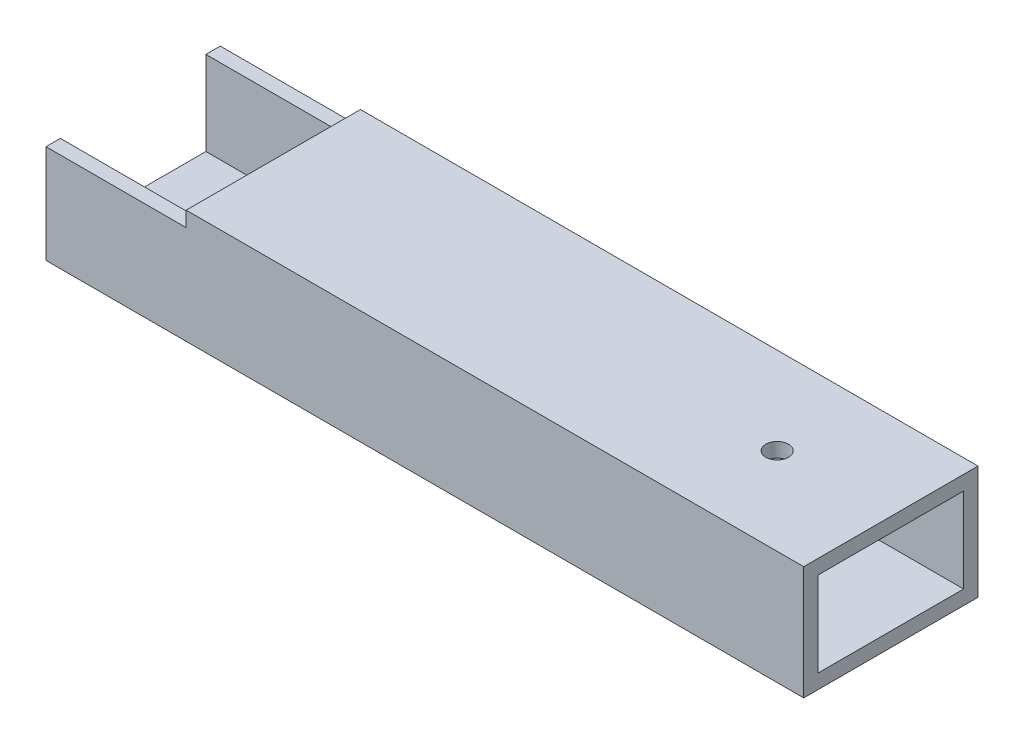
ISO-10303-21;
HEADER;
FILE_DESCRIPTION(('STEP AP214'),'2;1');
FILE_NAME('part.step','',(''),(''),'','','');
FILE_SCHEMA(('AUTOMOTIVE_DESIGN { 1 0 10303 214 1 1 1 1 }'));
ENDSEC;
DATA;
#1=APPLICATION_CONTEXT('core data for automotive mechanical design processes');
#2=APPLICATION_PROTOCOL_DEFINITION('international standard','automotive_design',2000,#1);
#3=PRODUCT_CONTEXT('',#1,'mechanical');
#4=PRODUCT('Part','Part','',(#3));
#5=PRODUCT_RELATED_PRODUCT_CATEGORY('part','',(#4));
#6=PRODUCT_DEFINITION_FORMATION('','',#4);
#7=PRODUCT_DEFINITION_CONTEXT('part definition',#1,'design');
#8=PRODUCT_DEFINITION('design','',#6,#7);
#9=PRODUCT_DEFINITION_SHAPE('','',#8);
#10=(LENGTH_UNIT() NAMED_UNIT(*) SI_UNIT(.MILLI.,.METRE.));
#11=(NAMED_UNIT(*) PLANE_ANGLE_UNIT() SI_UNIT($,.RADIAN.));
#12=(NAMED_UNIT(*) SI_UNIT($,.STERADIAN.) SOLID_ANGLE_UNIT());
#13=UNCERTAINTY_MEASURE_WITH_UNIT(LENGTH_MEASURE(1.E-05),#10,'distance_accuracy_value','');
#14=(GEOMETRIC_REPRESENTATION_CONTEXT(3) GLOBAL_UNCERTAINTY_ASSIGNED_CONTEXT((#13)) GLOBAL_UNIT_ASSIGNED_CONTEXT((#10,
#11,#12)) REPRESENTATION_CONTEXT('',''));
#15=CARTESIAN_POINT('',(0.,0.,0.));
#16=DIRECTION('',(0.,0.,1.));
#17=DIRECTION('',(1.,0.,0.));
#18=AXIS2_PLACEMENT_3D('',#15,#16,#17);
#19=CARTESIAN_POINT('',(-50.,2.,-9.5));
#20=DIRECTION('',(1.,0.,0.));
#21=DIRECTION('',(0.,0.,-1.));
#22=AXIS2_PLACEMENT_3D('',#19,#20,#21);
#23=PLANE('',#22);
#24=DIRECTION('',(0.,-1.,0.));
#25=VECTOR('',#24,1.);
#26=CARTESIAN_POINT('',(-50.,0.,-9.6));
#27=LINE('',#26,#25);
#28=CARTESIAN_POINT('',(-50.,0.,-9.6));
#29=VERTEX_POINT('',#28);
#30=CARTESIAN_POINT('',(-50.,-11.1,-9.6));
#31=VERTEX_POINT('',#30);
#32=EDGE_CURVE('E199',#29,#31,#27,.T.);
#33=ORIENTED_EDGE('',*,*,#32,.F.);
#34=DIRECTION('',(0.,0.,1.));
#35=VECTOR('',#34,1.);
#36=CARTESIAN_POINT('',(-50.,0.,0.));
#37=LINE('',#36,#35);
#38=CARTESIAN_POINT('',(-50.,0.,-11.5));
#39=VERTEX_POINT('',#38);
#40=EDGE_CURVE('E169',#39,#29,#37,.T.);
#41=ORIENTED_EDGE('',*,*,#40,.F.);
#42=DIRECTION('',(0.,1.,0.));
#43=VECTOR('',#42,1.);
#44=CARTESIAN_POINT('',(-50.,-13.,-11.5));
#45=LINE('',#44,#43);
#46=CARTESIAN_POINT('',(-50.,-13.,-11.5));
#47=VERTEX_POINT('',#46);
#48=EDGE_CURVE('E237',#47,#39,#45,.T.);
#49=ORIENTED_EDGE('',*,*,#48,.F.);
#50=DIRECTION('',(0.,0.,1.));
#51=VECTOR('',#50,1.);
#52=CARTESIAN_POINT('',(-50.,-13.,0.));
#53=LINE('',#52,#51);
#54=CARTESIAN_POINT('',(-50.,-13.,11.5));
#55=VERTEX_POINT('',#54);
#56=EDGE_CURVE('E247',#47,#55,#53,.T.);
#57=ORIENTED_EDGE('',*,*,#56,.T.);
#58=DIRECTION('',(0.,1.,0.));
#59=VECTOR('',#58,1.);
#60=CARTESIAN_POINT('',(-50.,-13.,11.5));
#61=LINE('',#60,#59);
#62=CARTESIAN_POINT('',(-50.,0.,11.5));
#63=VERTEX_POINT('',#62);
#64=EDGE_CURVE('E253',#55,#63,#61,.T.);
#65=ORIENTED_EDGE('',*,*,#64,.T.);
#66=CARTESIAN_POINT('',(-50.,0.,9.6));
#67=VERTEX_POINT('',#66);
#68=EDGE_CURVE('E164',#67,#63,#37,.T.);
#69=ORIENTED_EDGE('',*,*,#68,.F.);
#70=DIRECTION('',(0.,-1.,0.));
#71=VECTOR('',#70,1.);
#72=CARTESIAN_POINT('',(-50.,0.,9.6));
#73=LINE('',#72,#71);
#74=CARTESIAN_POINT('',(-50.,-11.1,9.6));
#75=VERTEX_POINT('',#74);
#76=EDGE_CURVE('E192',#67,#75,#73,.T.);
#77=ORIENTED_EDGE('',*,*,#76,.T.);
#78=DIRECTION('',(0.,0.,-1.));
#79=VECTOR('',#78,1.);
#80=CARTESIAN_POINT('',(-50.,-11.1,0.));
#81=LINE('',#80,#79);
#82=EDGE_CURVE('E195',#75,#31,#81,.T.);
#83=ORIENTED_EDGE('',*,*,#82,.T.);
#84=EDGE_LOOP('',(#33,#41,#49,#57,#65,#69,#77,#83));
#85=FACE_BOUND('',#84,.T.);
#86=ADVANCED_FACE('F70',(#85),#23,.F.);
#87=CARTESIAN_POINT('',(50.,2.,-9.5));
#88=DIRECTION('',(1.,0.,0.));
#89=DIRECTION('',(0.,0.,-1.));
#90=AXIS2_PLACEMENT_3D('',#87,#88,#89);
#91=PLANE('',#90);
#92=DIRECTION('',(0.,0.,1.));
#93=VECTOR('',#92,1.);
#94=CARTESIAN_POINT('',(50.,-13.,0.));
#95=LINE('',#94,#93);
#96=CARTESIAN_POINT('',(50.,-13.,-11.5));
#97=VERTEX_POINT('',#96);
#98=CARTESIAN_POINT('',(50.,-13.,11.5));
#99=VERTEX_POINT('',#98);
#100=EDGE_CURVE('E245',#97,#99,#95,.T.);
#101=ORIENTED_EDGE('',*,*,#100,.F.);
#102=DIRECTION('',(0.,1.,0.));
#103=VECTOR('',#102,1.);
#104=CARTESIAN_POINT('',(50.,-13.,-11.5));
#105=LINE('',#104,#103);
#106=CARTESIAN_POINT('',(50.,2.,-11.5));
#107=VERTEX_POINT('',#106);
#108=EDGE_CURVE('E234',#97,#107,#105,.T.);
#109=ORIENTED_EDGE('',*,*,#108,.T.);
#110=DIRECTION('',(0.,0.,1.));
#111=VECTOR('',#110,1.);
#112=CARTESIAN_POINT('',(50.,2.,-9.5));
#113=LINE('',#112,#111);
#114=CARTESIAN_POINT('',(50.,2.,11.5));
#115=VERTEX_POINT('',#114);
#116=EDGE_CURVE('E261',#107,#115,#113,.T.);
#117=ORIENTED_EDGE('',*,*,#116,.T.);
#118=DIRECTION('',(0.,1.,0.));
#119=VECTOR('',#118,1.);
#120=CARTESIAN_POINT('',(50.,-13.,11.5));
#121=LINE('',#120,#119);
#122=EDGE_CURVE('E255',#99,#115,#121,.T.);
#123=ORIENTED_EDGE('',*,*,#122,.F.);
#124=EDGE_LOOP('',(#101,#109,#117,#123));
#125=FACE_BOUND('',#124,.T.);
#126=DIRECTION('',(0.,-1.,0.));
#127=VECTOR('',#126,1.);
#128=CARTESIAN_POINT('',(50.,0.,9.6));
#129=LINE('',#128,#127);
#130=CARTESIAN_POINT('',(50.,0.1,9.6));
#131=VERTEX_POINT('',#130);
#132=CARTESIAN_POINT('',(50.,-11.1,9.6));
#133=VERTEX_POINT('',#132);
#134=EDGE_CURVE('E203',#131,#133,#129,.T.);
#135=ORIENTED_EDGE('',*,*,#134,.F.);
#136=DIRECTION('',(0.,0.,-1.));
#137=VECTOR('',#136,1.);
#138=CARTESIAN_POINT('',(50.,0.1,0.));
#139=LINE('',#138,#137);
#140=CARTESIAN_POINT('',(50.,0.1,-9.6));
#141=VERTEX_POINT('',#140);
#142=EDGE_CURVE('E191',#131,#141,#139,.T.);
#143=ORIENTED_EDGE('',*,*,#142,.T.);
#144=DIRECTION('',(0.,-1.,0.));
#145=VECTOR('',#144,1.);
#146=CARTESIAN_POINT('',(50.,0.,-9.6));
#147=LINE('',#146,#145);
#148=CARTESIAN_POINT('',(50.,-11.1,-9.6));
#149=VERTEX_POINT('',#148);
#150=EDGE_CURVE('E196',#141,#149,#147,.T.);
#151=ORIENTED_EDGE('',*,*,#150,.T.);
#152=DIRECTION('',(0.,0.,-1.));
#153=VECTOR('',#152,1.);
#154=CARTESIAN_POINT('',(50.,-11.1,0.));
#155=LINE('',#154,#153);
#156=EDGE_CURVE('E205',#133,#149,#155,.T.);
#157=ORIENTED_EDGE('',*,*,#156,.F.);
#158=EDGE_LOOP('',(#135,#143,#151,#157));
#159=FACE_BOUND('',#158,.T.);
#160=ADVANCED_FACE('F72',(#125,#159),#91,.T.);
#161=CARTESIAN_POINT('',(35.,2.,0.));
#162=DIRECTION('',(0.,-1.,0.));
#163=DIRECTION('',(0.,0.,-1.));
#164=AXIS2_PLACEMENT_3D('',#161,#162,#163);
#165=CYLINDRICAL_SURFACE('',#164,1.5);
#166=CARTESIAN_POINT('',(35.,2.,0.));
#167=DIRECTION('',(0.,1.,0.));
#168=DIRECTION('',(0.,0.,1.));
#169=AXIS2_PLACEMENT_3D('',#166,#167,#168);
#170=CIRCLE('',#169,1.5);
#171=CARTESIAN_POINT('',(35.,2.,1.5));
#172=VERTEX_POINT('',#171);
#173=EDGE_CURVE('E257',#172,#172,#170,.T.);
#174=ORIENTED_EDGE('',*,*,#173,.T.);
#175=EDGE_LOOP('',(#174));
#176=FACE_BOUND('',#175,.T.);
#177=CARTESIAN_POINT('',(35.,0.1,0.));
#178=DIRECTION('',(0.,-1.,0.));
#179=DIRECTION('',(0.,0.,-1.));
#180=AXIS2_PLACEMENT_3D('',#177,#178,#179);
#181=CIRCLE('',#180,1.5);
#182=CARTESIAN_POINT('',(35.,0.1,-1.5));
#183=VERTEX_POINT('',#182);
#184=EDGE_CURVE('E218',#183,#183,#181,.T.);
#185=ORIENTED_EDGE('',*,*,#184,.T.);
#186=EDGE_LOOP('',(#185));
#187=FACE_BOUND('',#186,.T.);
#188=ADVANCED_FACE('F303',(#176,#187),#165,.F.);
#189=CARTESIAN_POINT('',(0.,0.,0.));
#190=DIRECTION('',(0.,1.,0.));
#191=DIRECTION('',(0.,0.,1.));
#192=AXIS2_PLACEMENT_3D('',#189,#190,#191);
#193=PLANE('',#192);
#194=ORIENTED_EDGE('',*,*,#40,.T.);
#195=DIRECTION('',(1.,0.,0.));
#196=VECTOR('',#195,1.);
#197=CARTESIAN_POINT('',(0.,0.,-9.6));
#198=LINE('',#197,#196);
#199=CARTESIAN_POINT('',(-31.5,0.,-9.6));
#200=VERTEX_POINT('',#199);
#201=EDGE_CURVE('E78',#29,#200,#198,.T.);
#202=ORIENTED_EDGE('',*,*,#201,.T.);
#203=DIRECTION('',(0.,0.,-1.));
#204=VECTOR('',#203,1.);
#205=CARTESIAN_POINT('',(-31.5,0.,0.));
#206=LINE('',#205,#204);
#207=CARTESIAN_POINT('',(-31.5,0.,-11.5));
#208=VERTEX_POINT('',#207);
#209=EDGE_CURVE('E175',#200,#208,#206,.T.);
#210=ORIENTED_EDGE('',*,*,#209,.T.);
#211=DIRECTION('',(-1.,0.,0.));
#212=VECTOR('',#211,1.);
#213=CARTESIAN_POINT('',(0.,0.,-11.5));
#214=LINE('',#213,#212);
#215=EDGE_CURVE('E225',#208,#39,#214,.T.);
#216=ORIENTED_EDGE('',*,*,#215,.T.);
#217=EDGE_LOOP('',(#194,#202,#210,#216));
#218=FACE_BOUND('',#217,.T.);
#219=ADVANCED_FACE('F310',(#218),#193,.T.);
#220=CARTESIAN_POINT('',(0.,2.,0.));
#221=DIRECTION('',(0.,-1.,0.));
#222=DIRECTION('',(0.,0.,-1.));
#223=AXIS2_PLACEMENT_3D('',#220,#221,#222);
#224=PLANE('',#223);
#225=ORIENTED_EDGE('',*,*,#173,.F.);
#226=EDGE_LOOP('',(#225));
#227=FACE_BOUND('',#226,.T.);
#228=DIRECTION('',(1.,0.,0.));
#229=VECTOR('',#228,1.);
#230=CARTESIAN_POINT('',(-50.,2.,-11.5));
#231=LINE('',#230,#229);
#232=CARTESIAN_POINT('',(-31.5,2.,-11.5));
#233=VERTEX_POINT('',#232);
#234=EDGE_CURVE('E241',#233,#107,#231,.T.);
#235=ORIENTED_EDGE('',*,*,#234,.F.);
#236=DIRECTION('',(0.,0.,-1.));
#237=VECTOR('',#236,1.);
#238=CARTESIAN_POINT('',(-31.5,2.,0.));
#239=LINE('',#238,#237);
#240=CARTESIAN_POINT('',(-31.5,2.,11.5));
#241=VERTEX_POINT('',#240);
#242=EDGE_CURVE('E486',#241,#233,#239,.T.);
#243=ORIENTED_EDGE('',*,*,#242,.F.);
#244=DIRECTION('',(1.,0.,0.));
#245=VECTOR('',#244,1.);
#246=CARTESIAN_POINT('',(0.,2.,11.5));
#247=LINE('',#246,#245);
#248=EDGE_CURVE('E180',#241,#115,#247,.T.);
#249=ORIENTED_EDGE('',*,*,#248,.T.);
#250=ORIENTED_EDGE('',*,*,#116,.F.);
#251=EDGE_LOOP('',(#235,#243,#249,#250));
#252=FACE_BOUND('',#251,.T.);
#253=ADVANCED_FACE('F307',(#227,#252),#224,.F.);
#254=CARTESIAN_POINT('',(0.,-13.,11.5));
#255=DIRECTION('',(0.,0.,1.));
#256=DIRECTION('',(1.,0.,0.));
#257=AXIS2_PLACEMENT_3D('',#254,#255,#256);
#258=PLANE('',#257);
#259=DIRECTION('',(0.,1.,0.));
#260=VECTOR('',#259,1.);
#261=CARTESIAN_POINT('',(-31.5,0.,11.5));
#262=LINE('',#261,#260);
#263=CARTESIAN_POINT('',(-31.5,0.,11.5));
#264=VERTEX_POINT('',#263);
#265=EDGE_CURVE('E173',#264,#241,#262,.T.);
#266=ORIENTED_EDGE('',*,*,#265,.F.);
#267=DIRECTION('',(1.,0.,0.));
#268=VECTOR('',#267,1.);
#269=CARTESIAN_POINT('',(0.,0.,11.5));
#270=LINE('',#269,#268);
#271=EDGE_CURVE('E158',#63,#264,#270,.T.);
#272=ORIENTED_EDGE('',*,*,#271,.F.);
#273=ORIENTED_EDGE('',*,*,#64,.F.);
#274=DIRECTION('',(1.,0.,0.));
#275=VECTOR('',#274,1.);
#276=CARTESIAN_POINT('',(0.,-13.,11.5));
#277=LINE('',#276,#275);
#278=EDGE_CURVE('E250',#55,#99,#277,.T.);
#279=ORIENTED_EDGE('',*,*,#278,.T.);
#280=ORIENTED_EDGE('',*,*,#122,.T.);
#281=ORIENTED_EDGE('',*,*,#248,.F.);
#282=EDGE_LOOP('',(#266,#272,#273,#279,#280,#281));
#283=FACE_BOUND('',#282,.T.);
#284=ADVANCED_FACE('F178',(#283),#258,.T.);
#285=CARTESIAN_POINT('',(-50.,-13.,-11.5));
#286=DIRECTION('',(0.,0.,1.));
#287=DIRECTION('',(1.,0.,0.));
#288=AXIS2_PLACEMENT_3D('',#285,#286,#287);
#289=PLANE('',#288);
#290=ORIENTED_EDGE('',*,*,#215,.F.);
#291=DIRECTION('',(0.,1.,0.));
#292=VECTOR('',#291,1.);
#293=CARTESIAN_POINT('',(-31.5,0.,-11.5));
#294=LINE('',#293,#292);
#295=EDGE_CURVE('E181',#208,#233,#294,.T.);
#296=ORIENTED_EDGE('',*,*,#295,.T.);
#297=ORIENTED_EDGE('',*,*,#234,.T.);
#298=ORIENTED_EDGE('',*,*,#108,.F.);
#299=DIRECTION('',(1.,0.,0.));
#300=VECTOR('',#299,1.);
#301=CARTESIAN_POINT('',(-50.,-13.,-11.5));
#302=LINE('',#301,#300);
#303=EDGE_CURVE('E240',#47,#97,#302,.T.);
#304=ORIENTED_EDGE('',*,*,#303,.F.);
#305=ORIENTED_EDGE('',*,*,#48,.T.);
#306=EDGE_LOOP('',(#290,#296,#297,#298,#304,#305));
#307=FACE_BOUND('',#306,.T.);
#308=ADVANCED_FACE('F288',(#307),#289,.F.);
#309=CARTESIAN_POINT('',(0.,-13.,0.));
#310=DIRECTION('',(0.,1.,0.));
#311=DIRECTION('',(0.,0.,1.));
#312=AXIS2_PLACEMENT_3D('',#309,#310,#311);
#313=PLANE('',#312);
#314=ORIENTED_EDGE('',*,*,#100,.T.);
#315=ORIENTED_EDGE('',*,*,#278,.F.);
#316=ORIENTED_EDGE('',*,*,#56,.F.);
#317=ORIENTED_EDGE('',*,*,#303,.T.);
#318=EDGE_LOOP('',(#314,#315,#316,#317));
#319=FACE_BOUND('',#318,.T.);
#320=CARTESIAN_POINT('',(35.,-13.,0.));
#321=DIRECTION('',(0.,-1.,0.));
#322=DIRECTION('',(0.,0.,-1.));
#323=AXIS2_PLACEMENT_3D('',#320,#321,#322);
#324=CIRCLE('',#323,1.5);
#325=CARTESIAN_POINT('',(35.,-13.,-1.5));
#326=VERTEX_POINT('',#325);
#327=EDGE_CURVE('E168',#326,#326,#324,.T.);
#328=ORIENTED_EDGE('',*,*,#327,.F.);
#329=EDGE_LOOP('',(#328));
#330=FACE_BOUND('',#329,.T.);
#331=CARTESIAN_POINT('',(-35.,-13.,0.));
#332=DIRECTION('',(0.,-1.,0.));
#333=DIRECTION('',(0.,0.,-1.));
#334=AXIS2_PLACEMENT_3D('',#331,#332,#333);
#335=CIRCLE('',#334,1.5);
#336=CARTESIAN_POINT('',(-35.,-13.,-1.5));
#337=VERTEX_POINT('',#336);
#338=EDGE_CURVE('E231',#337,#337,#335,.T.);
#339=ORIENTED_EDGE('',*,*,#338,.F.);
#340=EDGE_LOOP('',(#339));
#341=FACE_BOUND('',#340,.T.);
#342=ADVANCED_FACE('F283',(#319,#330,#341),#313,.F.);
#343=CARTESIAN_POINT('',(-35.,-11.,0.));
#344=DIRECTION('',(0.,-1.,0.));
#345=DIRECTION('',(0.,0.,-1.));
#346=AXIS2_PLACEMENT_3D('',#343,#344,#345);
#347=CYLINDRICAL_SURFACE('',#346,1.5);
#348=CARTESIAN_POINT('',(-35.,-11.1,0.));
#349=DIRECTION('',(0.,-1.,0.));
#350=DIRECTION('',(0.,0.,-1.));
#351=AXIS2_PLACEMENT_3D('',#348,#349,#350);
#352=CIRCLE('',#351,1.5);
#353=CARTESIAN_POINT('',(-35.,-11.1,-1.5));
#354=VERTEX_POINT('',#353);
#355=EDGE_CURVE('E222',#354,#354,#352,.F.);
#356=ORIENTED_EDGE('',*,*,#355,.T.);
#357=EDGE_LOOP('',(#356));
#358=FACE_BOUND('',#357,.T.);
#359=ORIENTED_EDGE('',*,*,#338,.T.);
#360=EDGE_LOOP('',(#359));
#361=FACE_BOUND('',#360,.T.);
#362=ADVANCED_FACE('F280',(#358,#361),#347,.F.);
#363=CARTESIAN_POINT('',(35.,-11.,0.));
#364=DIRECTION('',(0.,-1.,0.));
#365=DIRECTION('',(0.,0.,-1.));
#366=AXIS2_PLACEMENT_3D('',#363,#364,#365);
#367=CYLINDRICAL_SURFACE('',#366,1.5);
#368=CARTESIAN_POINT('',(35.,-11.1,0.));
#369=DIRECTION('',(0.,-1.,0.));
#370=DIRECTION('',(0.,0.,-1.));
#371=AXIS2_PLACEMENT_3D('',#368,#369,#370);
#372=CIRCLE('',#371,1.5);
#373=CARTESIAN_POINT('',(35.,-11.1,-1.5));
#374=VERTEX_POINT('',#373);
#375=EDGE_CURVE('E221',#374,#374,#372,.F.);
#376=ORIENTED_EDGE('',*,*,#375,.T.);
#377=EDGE_LOOP('',(#376));
#378=FACE_BOUND('',#377,.T.);
#379=ORIENTED_EDGE('',*,*,#327,.T.);
#380=EDGE_LOOP('',(#379));
#381=FACE_BOUND('',#380,.T.);
#382=ADVANCED_FACE('F267',(#378,#381),#367,.F.);
#383=DIRECTION('',(1.,0.,0.));
#384=VECTOR('',#383,1.);
#385=CARTESIAN_POINT('',(0.,0.,9.6));
#386=LINE('',#385,#384);
#387=CARTESIAN_POINT('',(-31.5,0.,9.6));
#388=VERTEX_POINT('',#387);
#389=EDGE_CURVE('E84',#67,#388,#386,.T.);
#390=ORIENTED_EDGE('',*,*,#389,.F.);
#391=ORIENTED_EDGE('',*,*,#68,.T.);
#392=ORIENTED_EDGE('',*,*,#271,.T.);
#393=EDGE_CURVE('E161',#264,#388,#206,.T.);
#394=ORIENTED_EDGE('',*,*,#393,.T.);
#395=EDGE_LOOP('',(#390,#391,#392,#394));
#396=FACE_BOUND('',#395,.T.);
#397=ADVANCED_FACE('F160',(#396),#193,.T.);
#398=CARTESIAN_POINT('',(-50.,-11.1,0.));
#399=DIRECTION('',(0.,-1.,0.));
#400=DIRECTION('',(0.,0.,-1.));
#401=AXIS2_PLACEMENT_3D('',#398,#399,#400);
#402=PLANE('',#401);
#403=ORIENTED_EDGE('',*,*,#375,.F.);
#404=EDGE_LOOP('',(#403));
#405=FACE_BOUND('',#404,.T.);
#406=ORIENTED_EDGE('',*,*,#156,.T.);
#407=DIRECTION('',(1.,0.,0.));
#408=VECTOR('',#407,1.);
#409=CARTESIAN_POINT('',(-50.,-11.1,-9.6));
#410=LINE('',#409,#408);
#411=EDGE_CURVE('E212',#31,#149,#410,.T.);
#412=ORIENTED_EDGE('',*,*,#411,.F.);
#413=ORIENTED_EDGE('',*,*,#82,.F.);
#414=DIRECTION('',(1.,0.,0.));
#415=VECTOR('',#414,1.);
#416=CARTESIAN_POINT('',(-50.,-11.1,9.6));
#417=LINE('',#416,#415);
#418=EDGE_CURVE('E214',#75,#133,#417,.T.);
#419=ORIENTED_EDGE('',*,*,#418,.T.);
#420=EDGE_LOOP('',(#406,#412,#413,#419));
#421=FACE_BOUND('',#420,.T.);
#422=ORIENTED_EDGE('',*,*,#355,.F.);
#423=EDGE_LOOP('',(#422));
#424=FACE_BOUND('',#423,.T.);
#425=ADVANCED_FACE('F270',(#405,#421,#424),#402,.F.);
#426=CARTESIAN_POINT('',(-50.,0.1,0.));
#427=DIRECTION('',(0.,-1.,0.));
#428=DIRECTION('',(0.,0.,-1.));
#429=AXIS2_PLACEMENT_3D('',#426,#427,#428);
#430=PLANE('',#429);
#431=DIRECTION('',(0.,0.,1.));
#432=VECTOR('',#431,1.);
#433=CARTESIAN_POINT('',(-31.5,0.1,0.));
#434=LINE('',#433,#432);
#435=CARTESIAN_POINT('',(-31.5,0.1,-9.6));
#436=VERTEX_POINT('',#435);
#437=CARTESIAN_POINT('',(-31.5,0.1,9.6));
#438=VERTEX_POINT('',#437);
#439=EDGE_CURVE('E184',#436,#438,#434,.T.);
#440=ORIENTED_EDGE('',*,*,#439,.F.);
#441=DIRECTION('',(1.,0.,0.));
#442=VECTOR('',#441,1.);
#443=CARTESIAN_POINT('',(-50.,0.1,-9.6));
#444=LINE('',#443,#442);
#445=EDGE_CURVE('E210',#436,#141,#444,.T.);
#446=ORIENTED_EDGE('',*,*,#445,.T.);
#447=ORIENTED_EDGE('',*,*,#142,.F.);
#448=DIRECTION('',(1.,0.,0.));
#449=VECTOR('',#448,1.);
#450=CARTESIAN_POINT('',(-50.,0.1,9.6));
#451=LINE('',#450,#449);
#452=EDGE_CURVE('E90',#438,#131,#451,.T.);
#453=ORIENTED_EDGE('',*,*,#452,.F.);
#454=EDGE_LOOP('',(#440,#446,#447,#453));
#455=FACE_BOUND('',#454,.T.);
#456=ORIENTED_EDGE('',*,*,#184,.F.);
#457=EDGE_LOOP('',(#456));
#458=FACE_BOUND('',#457,.T.);
#459=ADVANCED_FACE('F273',(#455,#458),#430,.T.);
#460=CARTESIAN_POINT('',(-50.,0.,-9.6));
#461=DIRECTION('',(0.,0.,1.));
#462=DIRECTION('',(1.,0.,0.));
#463=AXIS2_PLACEMENT_3D('',#460,#461,#462);
#464=PLANE('',#463);
#465=DIRECTION('',(0.,1.,0.));
#466=VECTOR('',#465,1.);
#467=CARTESIAN_POINT('',(-31.5,0.,-9.6));
#468=LINE('',#467,#466);
#469=EDGE_CURVE('E189',#200,#436,#468,.T.);
#470=ORIENTED_EDGE('',*,*,#469,.F.);
#471=ORIENTED_EDGE('',*,*,#201,.F.);
#472=ORIENTED_EDGE('',*,*,#32,.T.);
#473=ORIENTED_EDGE('',*,*,#411,.T.);
#474=ORIENTED_EDGE('',*,*,#150,.F.);
#475=ORIENTED_EDGE('',*,*,#445,.F.);
#476=EDGE_LOOP('',(#470,#471,#472,#473,#474,#475));
#477=FACE_BOUND('',#476,.T.);
#478=ADVANCED_FACE('F346',(#477),#464,.T.);
#479=CARTESIAN_POINT('',(-50.,0.,9.6));
#480=DIRECTION('',(0.,0.,1.));
#481=DIRECTION('',(1.,0.,0.));
#482=AXIS2_PLACEMENT_3D('',#479,#480,#481);
#483=PLANE('',#482);
#484=ORIENTED_EDGE('',*,*,#389,.T.);
#485=DIRECTION('',(0.,1.,0.));
#486=VECTOR('',#485,1.);
#487=CARTESIAN_POINT('',(-31.5,0.,9.6));
#488=LINE('',#487,#486);
#489=EDGE_CURVE('E12',#388,#438,#488,.T.);
#490=ORIENTED_EDGE('',*,*,#489,.T.);
#491=ORIENTED_EDGE('',*,*,#452,.T.);
#492=ORIENTED_EDGE('',*,*,#134,.T.);
#493=ORIENTED_EDGE('',*,*,#418,.F.);
#494=ORIENTED_EDGE('',*,*,#76,.F.);
#495=EDGE_LOOP('',(#484,#490,#491,#492,#493,#494));
#496=FACE_BOUND('',#495,.T.);
#497=ADVANCED_FACE('F358',(#496),#483,.F.);
#498=CARTESIAN_POINT('',(-31.5,0.,0.));
#499=DIRECTION('',(1.,0.,0.));
#500=DIRECTION('',(0.,0.,-1.));
#501=AXIS2_PLACEMENT_3D('',#498,#499,#500);
#502=PLANE('',#501);
#503=ORIENTED_EDGE('',*,*,#469,.T.);
#504=ORIENTED_EDGE('',*,*,#439,.T.);
#505=ORIENTED_EDGE('',*,*,#489,.F.);
#506=ORIENTED_EDGE('',*,*,#393,.F.);
#507=ORIENTED_EDGE('',*,*,#265,.T.);
#508=ORIENTED_EDGE('',*,*,#242,.T.);
#509=ORIENTED_EDGE('',*,*,#295,.F.);
#510=ORIENTED_EDGE('',*,*,#209,.F.);
#511=EDGE_LOOP('',(#503,#504,#505,#506,#507,#508,#509,#510));
#512=FACE_BOUND('',#511,.T.);
#513=ADVANCED_FACE('F172',(#512),#502,.F.);
#514=CLOSED_SHELL('',(#86,#160,#188,#219,#253,#284,#308,#342,#362,#382,#397,#425,#459,#478,#497,#513));
#515=MANIFOLD_SOLID_BREP('B2',#514);
#516=ADVANCED_BREP_SHAPE_REPRESENTATION('',(#18,#515),#14);
#517=SHAPE_DEFINITION_REPRESENTATION(#9,#516);
ENDSEC;
END-ISO-10303-21;
